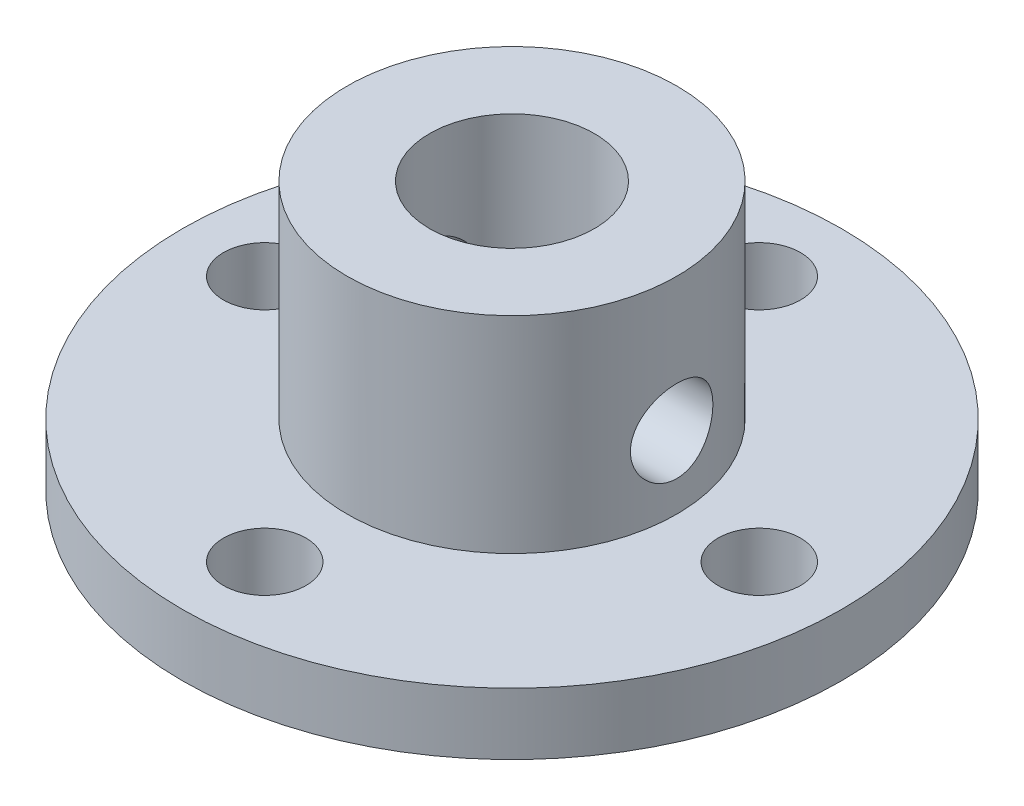
ISO-10303-21;
HEADER;
FILE_DESCRIPTION(('STEP AP214'),'2;1');
FILE_NAME('part.step','',(''),(''),'','','');
FILE_SCHEMA(('AUTOMOTIVE_DESIGN { 1 0 10303 214 1 1 1 1 }'));
ENDSEC;
DATA;
#1=APPLICATION_CONTEXT('core data for automotive mechanical design processes');
#2=APPLICATION_PROTOCOL_DEFINITION('international standard','automotive_design',2000,#1);
#3=PRODUCT_CONTEXT('',#1,'mechanical');
#4=PRODUCT('Part','Part','',(#3));
#5=PRODUCT_RELATED_PRODUCT_CATEGORY('part','',(#4));
#6=PRODUCT_DEFINITION_FORMATION('','',#4);
#7=PRODUCT_DEFINITION_CONTEXT('part definition',#1,'design');
#8=PRODUCT_DEFINITION('design','',#6,#7);
#9=PRODUCT_DEFINITION_SHAPE('','',#8);
#10=(LENGTH_UNIT() NAMED_UNIT(*) SI_UNIT(.MILLI.,.METRE.));
#11=(NAMED_UNIT(*) PLANE_ANGLE_UNIT() SI_UNIT($,.RADIAN.));
#12=(NAMED_UNIT(*) SI_UNIT($,.STERADIAN.) SOLID_ANGLE_UNIT());
#13=UNCERTAINTY_MEASURE_WITH_UNIT(LENGTH_MEASURE(1.E-05),#10,'distance_accuracy_value','');
#14=(GEOMETRIC_REPRESENTATION_CONTEXT(3) GLOBAL_UNCERTAINTY_ASSIGNED_CONTEXT((#13)) GLOBAL_UNIT_ASSIGNED_CONTEXT((#10,
#11,#12)) REPRESENTATION_CONTEXT('',''));
#15=CARTESIAN_POINT('',(0.,0.,0.));
#16=DIRECTION('',(0.,0.,1.));
#17=DIRECTION('',(1.,0.,0.));
#18=AXIS2_PLACEMENT_3D('',#15,#16,#17);
#19=CARTESIAN_POINT('',(0.,13.,0.));
#20=DIRECTION('',(0.,-1.,0.));
#21=DIRECTION('',(0.,0.,-1.));
#22=AXIS2_PLACEMENT_3D('',#19,#20,#21);
#23=CYLINDRICAL_SURFACE('',#22,8.);
#24=CARTESIAN_POINT('',(0.,13.,0.));
#25=DIRECTION('',(0.,1.,0.));
#26=DIRECTION('',(0.,0.,1.));
#27=AXIS2_PLACEMENT_3D('',#24,#25,#26);
#28=CIRCLE('',#27,8.);
#29=CARTESIAN_POINT('',(0.,13.,8.));
#30=VERTEX_POINT('',#29);
#31=EDGE_CURVE('E50',#30,#30,#28,.T.);
#32=ORIENTED_EDGE('',*,*,#31,.F.);
#33=EDGE_LOOP('',(#32));
#34=FACE_BOUND('',#33,.T.);
#35=CARTESIAN_POINT('',(0.,3.,0.));
#36=DIRECTION('',(0.,-1.,0.));
#37=DIRECTION('',(0.,0.,-1.));
#38=AXIS2_PLACEMENT_3D('',#35,#36,#37);
#39=CIRCLE('',#38,8.);
#40=CARTESIAN_POINT('',(0.,3.,-8.));
#41=VERTEX_POINT('',#40);
#42=EDGE_CURVE('E10',#41,#41,#39,.T.);
#43=ORIENTED_EDGE('',*,*,#42,.F.);
#44=EDGE_LOOP('',(#43));
#45=FACE_BOUND('',#44,.T.);
#46=CARTESIAN_POINT('',(7.74596669241484,6.5,-2.));
#47=CARTESIAN_POINT('',(7.74596880070288,6.61044060074126,-1.99999686287446));
#48=CARTESIAN_POINT('',(7.74835444811678,6.72091591894282,-1.99082099639812));
#49=CARTESIAN_POINT('',(7.75761489594051,6.93869406253881,-1.95441850037103));
#50=CARTESIAN_POINT('',(7.76449230897304,7.04599500357455,-1.92718136539368));
#51=CARTESIAN_POINT('',(7.7819097967692,7.25424283054975,-1.85559295970563));
#52=CARTESIAN_POINT('',(7.79244514152366,7.35519772430857,-1.81126378228359));
#53=CARTESIAN_POINT('',(7.81598553623007,7.54824868203191,-1.70681691300911));
#54=CARTESIAN_POINT('',(7.82899069102791,7.64034436966417,-1.64669855084855));
#55=CARTESIAN_POINT('',(7.856325730845,7.81508931620977,-1.51096674184951));
#56=CARTESIAN_POINT('',(7.87067678098427,7.89751488028004,-1.43506951016324));
#57=CARTESIAN_POINT('',(7.89890300412235,8.04860911548827,-1.27054565128053));
#58=CARTESIAN_POINT('',(7.91277813253111,8.1172765004974,-1.18191783534425));
#59=CARTESIAN_POINT('',(7.93872332416466,8.23982037410502,-0.992916160863164));
#60=CARTESIAN_POINT('',(7.95076549920474,8.29347711052917,-0.892395660956096));
#61=CARTESIAN_POINT('',(7.97144649540787,8.38304771532247,-0.683410547434209));
#62=CARTESIAN_POINT('',(7.98008581867475,8.41896420153241,-0.574947108633552));
#63=CARTESIAN_POINT('',(7.99283807078544,8.47131826766287,-0.355487007003329));
#64=CARTESIAN_POINT('',(7.99703915075451,8.48813571546127,-0.24458617563918));
#65=CARTESIAN_POINT('',(8.00074875285838,8.50300670342044,-0.0214630554102153));
#66=CARTESIAN_POINT('',(8.00025796877363,8.50106301776768,0.090759035630455));
#67=CARTESIAN_POINT('',(7.99470475962828,8.47874011979989,0.310704494344775));
#68=CARTESIAN_POINT('',(7.98974401872699,8.45877093995692,0.418472431202134));
#69=CARTESIAN_POINT('',(7.97592669219883,8.4016229839612,0.629076494827373));
#70=CARTESIAN_POINT('',(7.96706989918753,8.36444329169808,0.731912358740876));
#71=CARTESIAN_POINT('',(7.94630007760717,8.27359794345035,0.930813407003613));
#72=CARTESIAN_POINT('',(7.93436015756043,8.2197863642706,1.02680901953301));
#73=CARTESIAN_POINT('',(7.90871923047719,8.097315456707,1.20855124468098));
#74=CARTESIAN_POINT('',(7.89501791721992,8.02865354515151,1.29429607017101));
#75=CARTESIAN_POINT('',(7.86690971015616,7.8762330064141,1.45554807016991));
#76=CARTESIAN_POINT('',(7.85249375620734,7.79211608612178,1.5307153581504));
#77=CARTESIAN_POINT('',(7.82492034813365,7.6123200211678,1.66595275192604));
#78=CARTESIAN_POINT('',(7.81176295284776,7.5166403364072,1.72602215209203));
#79=CARTESIAN_POINT('',(7.78816397465319,7.31576797268083,1.8295762580452));
#80=CARTESIAN_POINT('',(7.77773586980577,7.21053141574944,1.87297913394098));
#81=CARTESIAN_POINT('',(7.76094912111966,6.99393162553884,1.94137124127268));
#82=CARTESIAN_POINT('',(7.75458960648175,6.88256970881349,1.96636441310582));
#83=CARTESIAN_POINT('',(7.74684284831312,6.6600323987815,1.99666371093214));
#84=CARTESIAN_POINT('',(7.74532871274918,6.5489297653363,2.0024723791357));
#85=CARTESIAN_POINT('',(7.74709874784831,6.32734245073748,1.99561359241244));
#86=CARTESIAN_POINT('',(7.75038247681013,6.21685771363901,1.98294783827904));
#87=CARTESIAN_POINT('',(7.76125665563648,6.00150858803624,1.93994037115013));
#88=CARTESIAN_POINT('',(7.768775761875,5.89658181874333,1.9098912546254));
#89=CARTESIAN_POINT('',(7.7872057461677,5.69325483371865,1.8332944653365));
#90=CARTESIAN_POINT('',(7.79811702598891,5.59485539275573,1.78674483817004));
#91=CARTESIAN_POINT('',(7.8223690967461,5.40524697770612,1.67741653434925));
#92=CARTESIAN_POINT('',(7.83575334885313,5.31421692796552,1.6143374030685));
#93=CARTESIAN_POINT('',(7.86333666457373,5.14384930975892,1.47412058586891));
#94=CARTESIAN_POINT('',(7.87753586182776,5.06451366667994,1.39698058961088));
#95=CARTESIAN_POINT('',(7.90557922425285,4.91775116594324,1.22852544196945));
#96=CARTESIAN_POINT('',(7.91940561649468,4.85067194996095,1.13690390506319));
#97=CARTESIAN_POINT('',(7.94477773290987,4.73285130643901,0.943405365389352));
#98=CARTESIAN_POINT('',(7.95632357603169,4.68210902671344,0.841528897915182));
#99=CARTESIAN_POINT('',(7.9757609259065,4.59884317237766,0.631116403462181));
#100=CARTESIAN_POINT('',(7.98367864017925,4.56618857249675,0.522634762055764));
#101=CARTESIAN_POINT('',(7.99508234716634,4.51963173231327,0.301499520637614));
#102=CARTESIAN_POINT('',(7.99856919514738,4.50572587300877,0.188846730082481));
#103=CARTESIAN_POINT('',(8.00068338817612,4.49726482084892,-0.0341670528866467));
#104=CARTESIAN_POINT('',(7.99943957759977,4.50219658180919,-0.144507653932044));
#105=CARTESIAN_POINT('',(7.99251792914887,4.5300956545887,-0.362734992829502));
#106=CARTESIAN_POINT('',(7.98684022314338,4.55306243002634,-0.470621803561857));
#107=CARTESIAN_POINT('',(7.97170865707778,4.61610443954172,-0.680342071289548));
#108=CARTESIAN_POINT('',(7.96227529004785,4.65608690662876,-0.782204989161726));
#109=CARTESIAN_POINT('',(7.94062577827316,4.75194115803914,-0.977834106083248));
#110=CARTESIAN_POINT('',(7.92840928277515,4.80781494534097,-1.07159928253127));
#111=CARTESIAN_POINT('',(7.90214499360574,4.93543046799227,-1.25080385684661));
#112=CARTESIAN_POINT('',(7.88806033883329,5.00752028580766,-1.33598997659667));
#113=CARTESIAN_POINT('',(7.85981298114379,5.1648457039547,-1.49323004054701));
#114=CARTESIAN_POINT('',(7.84565025934604,5.25008463222233,-1.56528065015318));
#115=CARTESIAN_POINT('',(7.81854951691005,5.43320282837892,-1.69552405294366));
#116=CARTESIAN_POINT('',(7.80563927346578,5.53128824673051,-1.75343323883276));
#117=CARTESIAN_POINT('',(7.78287910989656,5.73611097974964,-1.85185379317094));
#118=CARTESIAN_POINT('',(7.77302696466427,5.84284193218769,-1.8923778195043));
#119=CARTESIAN_POINT('',(7.75903817501475,6.04115402367032,-1.94884505714201));
#120=CARTESIAN_POINT('',(7.75417326006998,6.13178632877228,-1.96798634119376));
#121=CARTESIAN_POINT('',(7.7476367716524,6.31493773799538,-1.99356458514354));
#122=CARTESIAN_POINT('',(7.74596492578216,6.40745668048881,-2.0000026287435));
#123=CARTESIAN_POINT('',(7.74596669241484,6.5,-2.));
#124=B_SPLINE_CURVE_WITH_KNOTS('',3,(#46,#47,#48,#49,#50,#51,#52,#53,#54,#55,#56,#57,#58,#59,
#60,#61,#62,#63,#64,#65,#66,#67,#68,#69,#70,#71,#72,#73,#74,#75,#76,#77,#78,#79,#80,#81,#82,#83,
#84,#85,#86,#87,#88,#89,#90,#91,#92,#93,#94,#95,#96,#97,#98,#99,#100,#101,#102,#103,#104,#105,
#106,#107,#108,#109,#110,#111,#112,#113,#114,#115,#116,#117,#118,#119,#120,#121,#122,#123),
.UNSPECIFIED.,.T.,.F.,(4,2,2,2,2,2,2,2,2,2,2,2,2,2,2,2,2,2,2,2,2,2,2,2,2,2,2,2,2,2,2,2,2,2,2,2,
2,2,4),(0.,0.330981953388909,0.662156593142932,0.992904581732816,1.32366661404383,
1.66099163354381,1.99834817183893,2.34041197118336,2.68242527877674,3.01751000796277,
3.35254518932816,3.68014610151158,4.00776445379829,4.33834299403556,4.66897908375131,
5.00856373257529,5.34816424959842,5.68941145606722,6.03058560103638,6.36274859809374,
6.69488101747042,7.02157924007366,7.34831617137134,7.68146276687326,8.01466415108036,
8.35620264772255,8.69772332575643,9.03673658245543,9.3756843912723,9.70546756901965,
10.0352409390158,10.3632390124777,10.6912784459046,11.0271767726566,11.3631602525241,
11.7054118182895,12.0474137709606,12.3247826174462,12.6021278008238),.UNSPECIFIED.);
#125=CARTESIAN_POINT('',(7.74596669241484,6.5,-2.));
#126=VERTEX_POINT('',#125);
#127=EDGE_CURVE('E88',#126,#126,#124,.T.);
#128=ORIENTED_EDGE('',*,*,#127,.F.);
#129=EDGE_LOOP('',(#128));
#130=FACE_BOUND('',#129,.T.);
#131=CARTESIAN_POINT('',(-7.74596669241483,6.5,-2.));
#132=CARTESIAN_POINT('',(-7.74596880070288,6.38955939925874,-1.99999686287446));
#133=CARTESIAN_POINT('',(-7.74835444811678,6.27908408105718,-1.99082099639812));
#134=CARTESIAN_POINT('',(-7.75761489594051,6.06130593746119,-1.95441850037103));
#135=CARTESIAN_POINT('',(-7.76449230897304,5.95400499642545,-1.92718136539368));
#136=CARTESIAN_POINT('',(-7.7819097967692,5.74575716945026,-1.85559295970563));
#137=CARTESIAN_POINT('',(-7.79244514152366,5.64480227569144,-1.81126378228359));
#138=CARTESIAN_POINT('',(-7.81598553623007,5.4517513179681,-1.70681691300911));
#139=CARTESIAN_POINT('',(-7.82899069102791,5.35965563033583,-1.64669855084855));
#140=CARTESIAN_POINT('',(-7.856325730845,5.18491068379023,-1.51096674184951));
#141=CARTESIAN_POINT('',(-7.87067678098427,5.10248511971996,-1.43506951016324));
#142=CARTESIAN_POINT('',(-7.89890300412235,4.95139088451173,-1.27054565128053));
#143=CARTESIAN_POINT('',(-7.91277813253111,4.8827234995026,-1.18191783534425));
#144=CARTESIAN_POINT('',(-7.93872332416466,4.76017962589498,-0.992916160863165));
#145=CARTESIAN_POINT('',(-7.95076549920474,4.70652288947083,-0.892395660956097));
#146=CARTESIAN_POINT('',(-7.97144649540787,4.61695228467754,-0.683410547434211));
#147=CARTESIAN_POINT('',(-7.98008581867475,4.58103579846759,-0.574947108633553));
#148=CARTESIAN_POINT('',(-7.99283807078544,4.52868173233713,-0.355487007003329));
#149=CARTESIAN_POINT('',(-7.99703915075451,4.51186428453874,-0.244586175639181));
#150=CARTESIAN_POINT('',(-8.00074875285838,4.49699329657956,-0.0214630554102155));
#151=CARTESIAN_POINT('',(-8.00025796877363,4.49893698223232,0.090759035630455));
#152=CARTESIAN_POINT('',(-7.99470475962828,4.52125988020012,0.310704494344775));
#153=CARTESIAN_POINT('',(-7.98974401872699,4.54122906004309,0.418472431202134));
#154=CARTESIAN_POINT('',(-7.97592669219883,4.5983770160388,0.629076494827373));
#155=CARTESIAN_POINT('',(-7.96706989918753,4.63555670830193,0.731912358740876));
#156=CARTESIAN_POINT('',(-7.94630007760717,4.72640205654965,0.930813407003613));
#157=CARTESIAN_POINT('',(-7.93436015756043,4.7802136357294,1.02680901953301));
#158=CARTESIAN_POINT('',(-7.90871923047719,4.90268454329301,1.20855124468098));
#159=CARTESIAN_POINT('',(-7.89501791721992,4.9713464548485,1.29429607017101));
#160=CARTESIAN_POINT('',(-7.86690971015616,5.1237669935859,1.45554807016991));
#161=CARTESIAN_POINT('',(-7.85249375620734,5.20788391387822,1.5307153581504));
#162=CARTESIAN_POINT('',(-7.82492034813365,5.3876799788322,1.66595275192604));
#163=CARTESIAN_POINT('',(-7.81176295284776,5.4833596635928,1.72602215209203));
#164=CARTESIAN_POINT('',(-7.78816397465319,5.68423202731918,1.8295762580452));
#165=CARTESIAN_POINT('',(-7.77773586980577,5.78946858425056,1.87297913394098));
#166=CARTESIAN_POINT('',(-7.76094912111966,6.00606837446116,1.94137124127268));
#167=CARTESIAN_POINT('',(-7.75458960648175,6.11743029118651,1.96636441310582));
#168=CARTESIAN_POINT('',(-7.74684284831313,6.3399676012185,1.99666371093214));
#169=CARTESIAN_POINT('',(-7.74532871274919,6.4510702346637,2.0024723791357));
#170=CARTESIAN_POINT('',(-7.74709874784831,6.67265754926253,1.99561359241244));
#171=CARTESIAN_POINT('',(-7.75038247681013,6.78314228636099,1.98294783827904));
#172=CARTESIAN_POINT('',(-7.76125665563648,6.99849141196377,1.93994037115013));
#173=CARTESIAN_POINT('',(-7.768775761875,7.10341818125668,1.9098912546254));
#174=CARTESIAN_POINT('',(-7.7872057461677,7.30674516628135,1.8332944653365));
#175=CARTESIAN_POINT('',(-7.79811702598891,7.40514460724427,1.78674483817004));
#176=CARTESIAN_POINT('',(-7.8223690967461,7.59475302229388,1.67741653434925));
#177=CARTESIAN_POINT('',(-7.83575334885313,7.68578307203448,1.6143374030685));
#178=CARTESIAN_POINT('',(-7.86333666457373,7.85615069024108,1.47412058586891));
#179=CARTESIAN_POINT('',(-7.87753586182776,7.93548633332006,1.39698058961088));
#180=CARTESIAN_POINT('',(-7.90557922425285,8.08224883405677,1.22852544196945));
#181=CARTESIAN_POINT('',(-7.91940561649468,8.14932805003905,1.13690390506319));
#182=CARTESIAN_POINT('',(-7.94477773290987,8.267148693561,0.943405365389352));
#183=CARTESIAN_POINT('',(-7.95632357603169,8.31789097328657,0.841528897915183));
#184=CARTESIAN_POINT('',(-7.9757609259065,8.40115682762235,0.631116403462182));
#185=CARTESIAN_POINT('',(-7.98367864017925,8.43381142750325,0.522634762055765));
#186=CARTESIAN_POINT('',(-7.99508234716634,8.48036826768673,0.301499520637615));
#187=CARTESIAN_POINT('',(-7.99856919514738,8.49427412699123,0.188846730082482));
#188=CARTESIAN_POINT('',(-8.00068338817612,8.50273517915108,-0.0341670528866457));
#189=CARTESIAN_POINT('',(-7.99943957759977,8.49780341819082,-0.144507653932043));
#190=CARTESIAN_POINT('',(-7.99251792914887,8.4699043454113,-0.362734992829501));
#191=CARTESIAN_POINT('',(-7.98684022314338,8.44693756997366,-0.470621803561857));
#192=CARTESIAN_POINT('',(-7.97170865707778,8.38389556045828,-0.680342071289548));
#193=CARTESIAN_POINT('',(-7.96227529004785,8.34391309337124,-0.782204989161726));
#194=CARTESIAN_POINT('',(-7.94062577827316,8.24805884196086,-0.977834106083248));
#195=CARTESIAN_POINT('',(-7.92840928277515,8.19218505465903,-1.07159928253127));
#196=CARTESIAN_POINT('',(-7.90214499360574,8.06456953200774,-1.25080385684661));
#197=CARTESIAN_POINT('',(-7.88806033883329,7.99247971419234,-1.33598997659667));
#198=CARTESIAN_POINT('',(-7.85981298114379,7.83515429604531,-1.49323004054701));
#199=CARTESIAN_POINT('',(-7.84565025934604,7.74991536777767,-1.56528065015318));
#200=CARTESIAN_POINT('',(-7.81854951691005,7.56679717162108,-1.69552405294366));
#201=CARTESIAN_POINT('',(-7.80563927346578,7.46871175326949,-1.75343323883276));
#202=CARTESIAN_POINT('',(-7.78287910989656,7.26388902025036,-1.85185379317094));
#203=CARTESIAN_POINT('',(-7.77302696466427,7.15715806781231,-1.8923778195043));
#204=CARTESIAN_POINT('',(-7.75903817501475,6.95884597632968,-1.948845057142));
#205=CARTESIAN_POINT('',(-7.75417326006998,6.86821367122773,-1.96798634119376));
#206=CARTESIAN_POINT('',(-7.7476367716524,6.68506226200463,-1.99356458514354));
#207=CARTESIAN_POINT('',(-7.74596492578215,6.5925433195112,-2.0000026287435));
#208=CARTESIAN_POINT('',(-7.74596669241483,6.5,-2.));
#209=B_SPLINE_CURVE_WITH_KNOTS('',3,(#131,#132,#133,#134,#135,#136,#137,#138,#139,#140,#141,
#142,#143,#144,#145,#146,#147,#148,#149,#150,#151,#152,#153,#154,#155,#156,#157,#158,#159,#160,
#161,#162,#163,#164,#165,#166,#167,#168,#169,#170,#171,#172,#173,#174,#175,#176,#177,#178,#179,
#180,#181,#182,#183,#184,#185,#186,#187,#188,#189,#190,#191,#192,#193,#194,#195,#196,#197,#198,
#199,#200,#201,#202,#203,#204,#205,#206,#207,#208),.UNSPECIFIED.,.T.,.F.,(4,2,2,2,2,2,2,2,2,2,2,
2,2,2,2,2,2,2,2,2,2,2,2,2,2,2,2,2,2,2,2,2,2,2,2,2,2,2,4),(0.,0.330981953388909,
0.662156593142932,0.992904581732817,1.32366661404383,1.66099163354381,1.99834817183893,
2.34041197118336,2.68242527877674,3.01751000796277,3.35254518932816,3.68014610151158,
4.00776445379829,4.33834299403556,4.66897908375131,5.00856373257529,5.34816424959842,
5.68941145606722,6.03058560103638,6.36274859809374,6.69488101747041,7.02157924007366,
7.34831617137134,7.68146276687326,8.01466415108036,8.35620264772255,8.69772332575642,
9.03673658245543,9.3756843912723,9.70546756901965,10.0352409390158,10.3632390124777,
10.6912784459046,11.0271767726566,11.3631602525241,11.7054118182895,12.0474137709606,
12.3247826174462,12.6021278008238),.UNSPECIFIED.);
#210=CARTESIAN_POINT('',(-7.74596669241483,6.5,-2.));
#211=VERTEX_POINT('',#210);
#212=EDGE_CURVE('E93',#211,#211,#209,.T.);
#213=ORIENTED_EDGE('',*,*,#212,.F.);
#214=EDGE_LOOP('',(#213));
#215=FACE_BOUND('',#214,.T.);
#216=ADVANCED_FACE('F37',(#34,#45,#130,#215),#23,.T.);
#217=CARTESIAN_POINT('',(0.,13.,0.));
#218=DIRECTION('',(0.,-1.,0.));
#219=DIRECTION('',(0.,0.,-1.));
#220=AXIS2_PLACEMENT_3D('',#217,#218,#219);
#221=CYLINDRICAL_SURFACE('',#220,4.);
#222=CARTESIAN_POINT('',(3.46410161513776,6.5,-2.));
#223=CARTESIAN_POINT('',(3.46411185715888,6.60421320547435,-1.99999158748781));
#224=CARTESIAN_POINT('',(3.46887633544978,6.7085621765338,-1.99179963610437));
#225=CARTESIAN_POINT('',(3.48724701669072,6.9140551772306,-1.95944672580053));
#226=CARTESIAN_POINT('',(3.50087179788182,7.01519200324776,-1.93525221095662));
#227=CARTESIAN_POINT('',(3.53498701490001,7.21090315644694,-1.8721998159803));
#228=CARTESIAN_POINT('',(3.55544089069169,7.30550925884925,-1.83341988295963));
#229=CARTESIAN_POINT('',(3.60085327291133,7.48684845047615,-1.74253507245138));
#230=CARTESIAN_POINT('',(3.62581202301253,7.57358111343677,-1.69042947410139));
#231=CARTESIAN_POINT('',(3.67993738819289,7.74461144313339,-1.569333074538));
#232=CARTESIAN_POINT('',(3.70928127465103,7.82811826759177,-1.49930407053533));
#233=CARTESIAN_POINT('',(3.76743965382121,7.9828167805706,-1.34650761698202));
#234=CARTESIAN_POINT('',(3.79625387610258,8.05400232620397,-1.26373385204841));
#235=CARTESIAN_POINT('',(3.85242953961661,8.1867343011885,-1.08097912631265));
#236=CARTESIAN_POINT('',(3.87956212851245,8.24730753542331,-0.980214377887153));
#237=CARTESIAN_POINT('',(3.92701512184167,8.35028170678709,-0.768314053336916));
#238=CARTESIAN_POINT('',(3.94733982363631,8.3926941123508,-0.657185076311985));
#239=CARTESIAN_POINT('',(3.97760922492053,8.45500932253118,-0.436089887818817));
#240=CARTESIAN_POINT('',(3.98818960442739,8.4762990526921,-0.326603580968785));
#241=CARTESIAN_POINT('',(4.00015167691179,8.50033223736903,-0.10514125740454));
#242=CARTESIAN_POINT('',(4.00153893568934,8.50308691359628,0.00683321168520758));
#243=CARTESIAN_POINT('',(3.99525963833124,8.49050665205486,0.219665048849572));
#244=CARTESIAN_POINT('',(3.98836991784381,8.47672396895637,0.320642398354138));
#245=CARTESIAN_POINT('',(3.96748490519435,8.43423831219188,0.518627543836088));
#246=CARTESIAN_POINT('',(3.95348908132771,8.40553422204788,0.615635042187701));
#247=CARTESIAN_POINT('',(3.91943166575325,8.33383486782005,0.804618783139259));
#248=CARTESIAN_POINT('',(3.89928883058403,8.29064737365578,0.896506847030398));
#249=CARTESIAN_POINT('',(3.8547529197337,8.1914731675971,1.07195360302662));
#250=CARTESIAN_POINT('',(3.83035832314967,8.13548187339533,1.15550929767728));
#251=CARTESIAN_POINT('',(3.7768878879846,8.00620929693394,1.3203473217964));
#252=CARTESIAN_POINT('',(3.7475875199635,7.93179394334797,1.40066815005872));
#253=CARTESIAN_POINT('',(3.68908681173623,7.77082055013965,1.54820874059556));
#254=CARTESIAN_POINT('',(3.65988656531257,7.68425325545188,1.61541842314846));
#255=CARTESIAN_POINT('',(3.60288312184969,7.49470361515182,1.73901066928442));
#256=CARTESIAN_POINT('',(3.57528639981415,7.39102795389158,1.7944346299561));
#257=CARTESIAN_POINT('',(3.52750900557152,7.174124657282,1.88663822600246));
#258=CARTESIAN_POINT('',(3.50732060092135,7.06090713396488,1.92343731642178));
#259=CARTESIAN_POINT('',(3.47889271634069,6.83757097743442,1.97436042205008));
#260=CARTESIAN_POINT('',(3.46983311696993,6.7279177619129,1.99005024423995));
#261=CARTESIAN_POINT('',(3.46235838723219,6.50719731696691,2.00303389322285));
#262=CARTESIAN_POINT('',(3.46393573778623,6.3961311417604,2.00034071463005));
#263=CARTESIAN_POINT('',(3.4766867308117,6.18869216284256,1.97807208668793));
#264=CARTESIAN_POINT('',(3.48679175013308,6.09204109778422,1.96037563342492));
#265=CARTESIAN_POINT('',(3.51388043102682,5.90326442745801,1.91139256926489));
#266=CARTESIAN_POINT('',(3.53086632010068,5.81114029850652,1.88010155724727));
#267=CARTESIAN_POINT('',(3.57072444159313,5.62917733819488,1.80329517720973));
#268=CARTESIAN_POINT('',(3.59383286486126,5.53964196629395,1.7571881273853));
#269=CARTESIAN_POINT('',(3.643122389945,5.36906145692096,1.65257412803176));
#270=CARTESIAN_POINT('',(3.66930506710298,5.28802071296949,1.59406080866498));
#271=CARTESIAN_POINT('',(3.72575996912669,5.12604246495734,1.45767433439708));
#272=CARTESIAN_POINT('',(3.75613166308566,5.04640569858222,1.37829054462748));
#273=CARTESIAN_POINT('',(3.81468469955797,4.90117552399527,1.20680899079904));
#274=CARTESIAN_POINT('',(3.84286530015463,4.83558685947316,1.11470694931991));
#275=CARTESIAN_POINT('',(3.89482723381867,4.71885254816729,0.917070725108058));
#276=CARTESIAN_POINT('',(3.91847283343884,4.66813376383323,0.811246195112494));
#277=CARTESIAN_POINT('',(3.95766709918776,4.58572419203039,0.591044729317864));
#278=CARTESIAN_POINT('',(3.97322287353397,4.5540166963159,0.476675402917652));
#279=CARTESIAN_POINT('',(3.99335016363174,4.51326287251486,0.253959364539763));
#280=CARTESIAN_POINT('',(3.9987985581427,4.50240425133573,0.1460228872683));
#281=CARTESIAN_POINT('',(4.00084260752374,4.49831346600433,-0.070251971469946));
#282=CARTESIAN_POINT('',(3.99744136141634,4.50507513147113,-0.178590198981615));
#283=CARTESIAN_POINT('',(3.98267937668509,4.53483282431641,-0.38507598613686));
#284=CARTESIAN_POINT('',(3.97185789309443,4.55672973730905,-0.48342464105742));
#285=CARTESIAN_POINT('',(3.94384187353387,4.61465395980667,-0.674891898931566));
#286=CARTESIAN_POINT('',(3.92664642364424,4.65068329570691,-0.768009749669773));
#287=CARTESIAN_POINT('',(3.8865186139318,4.73745425499141,-0.950846833596742));
#288=CARTESIAN_POINT('',(3.86337234005403,4.78875921975186,-1.0402503657229));
#289=CARTESIAN_POINT('',(3.81376266676027,4.9039152881181,-1.20954920326828));
#290=CARTESIAN_POINT('',(3.78729774583427,4.96777215410157,-1.28944011444319));
#291=CARTESIAN_POINT('',(3.73057218840582,5.11359663555942,-1.44582833859495));
#292=CARTESIAN_POINT('',(3.70019591726075,5.19673418080029,-1.52119665879199));
#293=CARTESIAN_POINT('',(3.64126158628571,5.37489222830609,-1.65732528394006));
#294=CARTESIAN_POINT('',(3.61270515130784,5.46992313136052,-1.71807266521244));
#295=CARTESIAN_POINT('',(3.55999186256751,5.67330889413025,-1.82486714716811));
#296=CARTESIAN_POINT('',(3.53600256268535,5.78198991073527,-1.87038902381914));
#297=CARTESIAN_POINT('',(3.5069621813237,5.95057811963095,-1.92395929504801));
#298=CARTESIAN_POINT('',(3.49844389329401,6.00764782059068,-1.93935666147967));
#299=CARTESIAN_POINT('',(3.48406059323535,6.12323255750019,-1.96508069805043));
#300=CARTESIAN_POINT('',(3.4781937263605,6.18174655275425,-1.97541091343282));
#301=CARTESIAN_POINT('',(3.47059023668758,6.28360078924729,-1.9887293296122));
#302=CARTESIAN_POINT('',(3.46816389731815,6.32673305725008,-1.99295091983786));
#303=CARTESIAN_POINT('',(3.46491740045177,6.4132356930929,-1.99858810035606));
#304=CARTESIAN_POINT('',(3.46409735040492,6.4566060766667,-2.00000350293331));
#305=CARTESIAN_POINT('',(3.46410161513776,6.5,-2.));
#306=B_SPLINE_CURVE_WITH_KNOTS('',3,(#222,#223,#224,#225,#226,#227,#228,#229,#230,#231,#232,
#233,#234,#235,#236,#237,#238,#239,#240,#241,#242,#243,#244,#245,#246,#247,#248,#249,#250,#251,
#252,#253,#254,#255,#256,#257,#258,#259,#260,#261,#262,#263,#264,#265,#266,#267,#268,#269,#270,
#271,#272,#273,#274,#275,#276,#277,#278,#279,#280,#281,#282,#283,#284,#285,#286,#287,#288,#289,
#290,#291,#292,#293,#294,#295,#296,#297,#298,#299,#300,#301,#302,#303,#304,#305),.UNSPECIFIED.,
.T.,.F.,(4,2,2,2,2,2,2,2,2,2,2,2,2,2,2,2,2,2,2,2,2,2,2,2,2,2,2,2,2,2,2,2,2,2,2,2,2,2,2,2,2,4),
(0.,0.312464245189431,0.625585785649609,0.937057191861536,1.24854545093096,1.58572462503713,
1.92307142172809,2.28315784481594,2.64301653931849,2.97726969939937,3.31132047376147,
3.61632194973143,3.92134625038977,4.2305906946636,4.5399459870461,4.87854382917848,
5.21740096495904,5.57777683462964,5.93777548427477,6.2692458171249,6.60048186380813,
6.89548366852118,7.19058104876193,7.49934592816242,7.80826972444162,8.15613487165293,
8.50411729960471,8.86128362829998,9.2181355962161,9.54224540783041,9.8662417359201,
10.1688884974705,10.4715786702809,10.7872150144301,11.1029966020551,11.450204837042,
11.7977188569438,12.1562149808128,12.3351395323571,12.5139387197526,12.6440387634036,
12.7741475095882),.UNSPECIFIED.);
#307=CARTESIAN_POINT('',(3.46410161513776,6.5,-2.));
#308=VERTEX_POINT('',#307);
#309=EDGE_CURVE('E66',#308,#308,#306,.T.);
#310=ORIENTED_EDGE('',*,*,#309,.T.);
#311=EDGE_LOOP('',(#310));
#312=FACE_BOUND('',#311,.T.);
#313=CARTESIAN_POINT('',(0.,0.,0.));
#314=DIRECTION('',(0.,1.,0.));
#315=DIRECTION('',(0.,0.,1.));
#316=AXIS2_PLACEMENT_3D('',#313,#314,#315);
#317=CIRCLE('',#316,4.);
#318=CARTESIAN_POINT('',(0.,0.,4.));
#319=VERTEX_POINT('',#318);
#320=EDGE_CURVE('E63',#319,#319,#317,.T.);
#321=ORIENTED_EDGE('',*,*,#320,.F.);
#322=EDGE_LOOP('',(#321));
#323=FACE_BOUND('',#322,.T.);
#324=CARTESIAN_POINT('',(0.,13.,0.));
#325=DIRECTION('',(0.,1.,0.));
#326=DIRECTION('',(0.,0.,1.));
#327=AXIS2_PLACEMENT_3D('',#324,#325,#326);
#328=CIRCLE('',#327,4.);
#329=CARTESIAN_POINT('',(0.,13.,4.));
#330=VERTEX_POINT('',#329);
#331=EDGE_CURVE('E55',#330,#330,#328,.T.);
#332=ORIENTED_EDGE('',*,*,#331,.T.);
#333=EDGE_LOOP('',(#332));
#334=FACE_BOUND('',#333,.T.);
#335=CARTESIAN_POINT('',(-3.46410161513775,6.5,-2.));
#336=CARTESIAN_POINT('',(-3.46411185715887,6.39578679452566,-1.99999158748781));
#337=CARTESIAN_POINT('',(-3.46887633544978,6.2914378234662,-1.99179963610437));
#338=CARTESIAN_POINT('',(-3.48724701669072,6.0859448227694,-1.95944672580053));
#339=CARTESIAN_POINT('',(-3.50087179788183,5.98480799675224,-1.93525221095662));
#340=CARTESIAN_POINT('',(-3.53498701490001,5.78909684355307,-1.8721998159803));
#341=CARTESIAN_POINT('',(-3.55544089069169,5.69449074115075,-1.83341988295963));
#342=CARTESIAN_POINT('',(-3.60085327291133,5.51315154952385,-1.74253507245138));
#343=CARTESIAN_POINT('',(-3.62581202301253,5.42641888656323,-1.69042947410139));
#344=CARTESIAN_POINT('',(-3.67993738819289,5.25538855686662,-1.569333074538));
#345=CARTESIAN_POINT('',(-3.70928127465103,5.17188173240823,-1.49930407053533));
#346=CARTESIAN_POINT('',(-3.76743965382121,5.0171832194294,-1.34650761698202));
#347=CARTESIAN_POINT('',(-3.79625387610258,4.94599767379603,-1.26373385204841));
#348=CARTESIAN_POINT('',(-3.85242953961661,4.8132656988115,-1.08097912631265));
#349=CARTESIAN_POINT('',(-3.87956212851245,4.75269246457669,-0.980214377887153));
#350=CARTESIAN_POINT('',(-3.92701512184167,4.64971829321291,-0.768314053336917));
#351=CARTESIAN_POINT('',(-3.94733982363631,4.6073058876492,-0.657185076311985));
#352=CARTESIAN_POINT('',(-3.97760922492053,4.54499067746882,-0.436089887818817));
#353=CARTESIAN_POINT('',(-3.98818960442739,4.5237009473079,-0.326603580968785));
#354=CARTESIAN_POINT('',(-4.00015167691179,4.49966776263097,-0.105141257404541));
#355=CARTESIAN_POINT('',(-4.00153893568934,4.49691308640372,0.00683321168520728));
#356=CARTESIAN_POINT('',(-3.99525963833124,4.50949334794514,0.219665048849572));
#357=CARTESIAN_POINT('',(-3.98836991784381,4.52327603104364,0.320642398354138));
#358=CARTESIAN_POINT('',(-3.96748490519435,4.56576168780813,0.518627543836088));
#359=CARTESIAN_POINT('',(-3.95348908132771,4.59446577795213,0.615635042187701));
#360=CARTESIAN_POINT('',(-3.91943166575325,4.66616513217995,0.804618783139259));
#361=CARTESIAN_POINT('',(-3.89928883058403,4.70935262634422,0.896506847030398));
#362=CARTESIAN_POINT('',(-3.8547529197337,4.8085268324029,1.07195360302662));
#363=CARTESIAN_POINT('',(-3.83035832314967,4.86451812660468,1.15550929767728));
#364=CARTESIAN_POINT('',(-3.7768878879846,4.99379070306606,1.3203473217964));
#365=CARTESIAN_POINT('',(-3.7475875199635,5.06820605665203,1.40066815005872));
#366=CARTESIAN_POINT('',(-3.68908681173623,5.22917944986035,1.54820874059556));
#367=CARTESIAN_POINT('',(-3.65988656531257,5.31574674454812,1.61541842314846));
#368=CARTESIAN_POINT('',(-3.60288312184969,5.50529638484818,1.73901066928442));
#369=CARTESIAN_POINT('',(-3.57528639981415,5.60897204610842,1.7944346299561));
#370=CARTESIAN_POINT('',(-3.52750900557152,5.825875342718,1.88663822600246));
#371=CARTESIAN_POINT('',(-3.50732060092135,5.93909286603513,1.92343731642178));
#372=CARTESIAN_POINT('',(-3.47889271634069,6.16242902256558,1.97436042205008));
#373=CARTESIAN_POINT('',(-3.46983311696993,6.2720822380871,1.99005024423995));
#374=CARTESIAN_POINT('',(-3.46235838723219,6.49280268303309,2.00303389322285));
#375=CARTESIAN_POINT('',(-3.46393573778623,6.6038688582396,2.00034071463005));
#376=CARTESIAN_POINT('',(-3.4766867308117,6.81130783715744,1.97807208668793));
#377=CARTESIAN_POINT('',(-3.48679175013308,6.90795890221579,1.96037563342492));
#378=CARTESIAN_POINT('',(-3.51388043102682,7.09673557254199,1.91139256926489));
#379=CARTESIAN_POINT('',(-3.53086632010068,7.18885970149348,1.88010155724727));
#380=CARTESIAN_POINT('',(-3.57072444159313,7.37082266180512,1.80329517720973));
#381=CARTESIAN_POINT('',(-3.59383286486126,7.46035803370605,1.7571881273853));
#382=CARTESIAN_POINT('',(-3.643122389945,7.63093854307904,1.65257412803176));
#383=CARTESIAN_POINT('',(-3.66930506710298,7.71197928703051,1.59406080866498));
#384=CARTESIAN_POINT('',(-3.72575996912669,7.87395753504266,1.45767433439709));
#385=CARTESIAN_POINT('',(-3.75613166308566,7.95359430141778,1.37829054462748));
#386=CARTESIAN_POINT('',(-3.81468469955797,8.09882447600473,1.20680899079904));
#387=CARTESIAN_POINT('',(-3.84286530015463,8.16441314052684,1.11470694931991));
#388=CARTESIAN_POINT('',(-3.89482723381867,8.28114745183271,0.917070725108059));
#389=CARTESIAN_POINT('',(-3.91847283343884,8.33186623616677,0.811246195112494));
#390=CARTESIAN_POINT('',(-3.95766709918776,8.41427580796961,0.591044729317864));
#391=CARTESIAN_POINT('',(-3.97322287353397,8.4459833036841,0.476675402917653));
#392=CARTESIAN_POINT('',(-3.99335016363174,8.48673712748514,0.253959364539764));
#393=CARTESIAN_POINT('',(-3.9987985581427,8.49759574866428,0.146022887268301));
#394=CARTESIAN_POINT('',(-4.00084260752374,8.50168653399568,-0.070251971469945));
#395=CARTESIAN_POINT('',(-3.99744136141634,8.49492486852887,-0.178590198981614));
#396=CARTESIAN_POINT('',(-3.98267937668509,8.4651671756836,-0.385075986136858));
#397=CARTESIAN_POINT('',(-3.97185789309443,8.44327026269095,-0.483424641057418));
#398=CARTESIAN_POINT('',(-3.94384187353387,8.38534604019333,-0.674891898931564));
#399=CARTESIAN_POINT('',(-3.92664642364424,8.34931670429309,-0.768009749669771));
#400=CARTESIAN_POINT('',(-3.8865186139318,8.2625457450086,-0.950846833596741));
#401=CARTESIAN_POINT('',(-3.86337234005404,8.21124078024814,-1.0402503657229));
#402=CARTESIAN_POINT('',(-3.81376266676027,8.09608471188191,-1.20954920326828));
#403=CARTESIAN_POINT('',(-3.78729774583427,8.03222784589844,-1.28944011444319));
#404=CARTESIAN_POINT('',(-3.73057218840582,7.88640336444059,-1.44582833859495));
#405=CARTESIAN_POINT('',(-3.70019591726075,7.80326581919972,-1.52119665879199));
#406=CARTESIAN_POINT('',(-3.64126158628571,7.62510777169391,-1.65732528394006));
#407=CARTESIAN_POINT('',(-3.61270515130784,7.53007686863949,-1.71807266521244));
#408=CARTESIAN_POINT('',(-3.55999186256751,7.32669110586976,-1.82486714716811));
#409=CARTESIAN_POINT('',(-3.53600256268535,7.21801008926473,-1.87038902381914));
#410=CARTESIAN_POINT('',(-3.5069621813237,7.04942188036906,-1.92395929504801));
#411=CARTESIAN_POINT('',(-3.49844389329401,6.99235217940932,-1.93935666147967));
#412=CARTESIAN_POINT('',(-3.48406059323535,6.87676744249981,-1.96508069805043));
#413=CARTESIAN_POINT('',(-3.4781937263605,6.81825344724575,-1.97541091343282));
#414=CARTESIAN_POINT('',(-3.47059023668758,6.71639921075271,-1.9887293296122));
#415=CARTESIAN_POINT('',(-3.46816389731816,6.67326694274993,-1.99295091983786));
#416=CARTESIAN_POINT('',(-3.46491740045177,6.58676430690711,-1.99858810035606));
#417=CARTESIAN_POINT('',(-3.46409735040492,6.5433939233333,-2.00000350293331));
#418=CARTESIAN_POINT('',(-3.46410161513775,6.5,-2.));
#419=B_SPLINE_CURVE_WITH_KNOTS('',3,(#335,#336,#337,#338,#339,#340,#341,#342,#343,#344,#345,
#346,#347,#348,#349,#350,#351,#352,#353,#354,#355,#356,#357,#358,#359,#360,#361,#362,#363,#364,
#365,#366,#367,#368,#369,#370,#371,#372,#373,#374,#375,#376,#377,#378,#379,#380,#381,#382,#383,
#384,#385,#386,#387,#388,#389,#390,#391,#392,#393,#394,#395,#396,#397,#398,#399,#400,#401,#402,
#403,#404,#405,#406,#407,#408,#409,#410,#411,#412,#413,#414,#415,#416,#417,#418),.UNSPECIFIED.,
.T.,.F.,(4,2,2,2,2,2,2,2,2,2,2,2,2,2,2,2,2,2,2,2,2,2,2,2,2,2,2,2,2,2,2,2,2,2,2,2,2,2,2,2,2,4),
(0.,0.312464245189432,0.62558578564961,0.937057191861536,1.24854545093097,1.58572462503713,
1.92307142172809,2.28315784481594,2.64301653931849,2.97726969939937,3.31132047376147,
3.61632194973143,3.92134625038977,4.2305906946636,4.5399459870461,4.87854382917848,
5.21740096495904,5.57777683462963,5.93777548427477,6.2692458171249,6.60048186380813,
6.89548366852118,7.19058104876193,7.49934592816242,7.80826972444161,8.15613487165293,
8.50411729960471,8.86128362829998,9.2181355962161,9.5422454078304,9.8662417359201,
10.1688884974705,10.4715786702809,10.7872150144301,11.102996602055,11.450204837042,
11.7977188569438,12.1562149808128,12.3351395323571,12.5139387197526,12.6440387634036,
12.7741475095882),.UNSPECIFIED.);
#420=CARTESIAN_POINT('',(-3.46410161513775,6.5,-2.));
#421=VERTEX_POINT('',#420);
#422=EDGE_CURVE('E41',#421,#421,#419,.T.);
#423=ORIENTED_EDGE('',*,*,#422,.T.);
#424=EDGE_LOOP('',(#423));
#425=FACE_BOUND('',#424,.T.);
#426=ADVANCED_FACE('F71',(#312,#323,#334,#425),#221,.F.);
#427=CARTESIAN_POINT('',(0.,13.,0.));
#428=DIRECTION('',(0.,1.,0.));
#429=DIRECTION('',(0.,0.,1.));
#430=AXIS2_PLACEMENT_3D('',#427,#428,#429);
#431=PLANE('',#430);
#432=ORIENTED_EDGE('',*,*,#31,.T.);
#433=EDGE_LOOP('',(#432));
#434=FACE_BOUND('',#433,.T.);
#435=ORIENTED_EDGE('',*,*,#331,.F.);
#436=EDGE_LOOP('',(#435));
#437=FACE_BOUND('',#436,.T.);
#438=ADVANCED_FACE('F149',(#434,#437),#431,.T.);
#439=CARTESIAN_POINT('',(0.,0.,0.));
#440=DIRECTION('',(0.,1.,0.));
#441=DIRECTION('',(0.,0.,1.));
#442=AXIS2_PLACEMENT_3D('',#439,#440,#441);
#443=PLANE('',#442);
#444=ORIENTED_EDGE('',*,*,#320,.T.);
#445=EDGE_LOOP('',(#444));
#446=FACE_BOUND('',#445,.T.);
#447=CARTESIAN_POINT('',(0.,0.,0.));
#448=DIRECTION('',(0.,-1.,0.));
#449=DIRECTION('',(0.,0.,-1.));
#450=AXIS2_PLACEMENT_3D('',#447,#448,#449);
#451=CIRCLE('',#450,16.);
#452=CARTESIAN_POINT('',(0.,0.,-16.));
#453=VERTEX_POINT('',#452);
#454=EDGE_CURVE('E59',#453,#453,#451,.T.);
#455=ORIENTED_EDGE('',*,*,#454,.T.);
#456=EDGE_LOOP('',(#455));
#457=FACE_BOUND('',#456,.T.);
#458=CARTESIAN_POINT('',(0.,0.,12.));
#459=DIRECTION('',(0.,-1.,0.));
#460=DIRECTION('',(0.,0.,-1.));
#461=AXIS2_PLACEMENT_3D('',#458,#459,#460);
#462=CIRCLE('',#461,2.);
#463=CARTESIAN_POINT('',(0.,0.,10.));
#464=VERTEX_POINT('',#463);
#465=EDGE_CURVE('E115',#464,#464,#462,.T.);
#466=ORIENTED_EDGE('',*,*,#465,.F.);
#467=EDGE_LOOP('',(#466));
#468=FACE_BOUND('',#467,.T.);
#469=CARTESIAN_POINT('',(12.,0.,0.));
#470=DIRECTION('',(0.,-1.,0.));
#471=DIRECTION('',(0.,0.,-1.));
#472=AXIS2_PLACEMENT_3D('',#469,#470,#471);
#473=CIRCLE('',#472,2.);
#474=CARTESIAN_POINT('',(12.,0.,-2.00000000000004));
#475=VERTEX_POINT('',#474);
#476=EDGE_CURVE('E109',#475,#475,#473,.T.);
#477=ORIENTED_EDGE('',*,*,#476,.F.);
#478=EDGE_LOOP('',(#477));
#479=FACE_BOUND('',#478,.T.);
#480=CARTESIAN_POINT('',(3.36651784687918E-13,0.,-12.));
#481=DIRECTION('',(0.,-1.,0.));
#482=DIRECTION('',(0.,0.,-1.));
#483=AXIS2_PLACEMENT_3D('',#480,#481,#482);
#484=CIRCLE('',#483,2.0000000000004);
#485=CARTESIAN_POINT('',(3.36651784687918E-13,0.,-14.0000000000004));
#486=VERTEX_POINT('',#485);
#487=EDGE_CURVE('E103',#486,#486,#484,.T.);
#488=ORIENTED_EDGE('',*,*,#487,.F.);
#489=EDGE_LOOP('',(#488));
#490=FACE_BOUND('',#489,.T.);
#491=CARTESIAN_POINT('',(-12.,0.,1.25693328198353E-13));
#492=DIRECTION('',(0.,-1.,0.));
#493=DIRECTION('',(0.,0.,-1.));
#494=AXIS2_PLACEMENT_3D('',#491,#492,#493);
#495=CIRCLE('',#494,2.);
#496=CARTESIAN_POINT('',(-12.,0.,-1.99999999999987));
#497=VERTEX_POINT('',#496);
#498=EDGE_CURVE('E99',#497,#497,#495,.T.);
#499=ORIENTED_EDGE('',*,*,#498,.F.);
#500=EDGE_LOOP('',(#499));
#501=FACE_BOUND('',#500,.T.);
#502=ADVANCED_FACE('F128',(#446,#457,#468,#479,#490,#501),#443,.F.);
#503=CARTESIAN_POINT('',(0.,3.,0.));
#504=DIRECTION('',(0.,-1.,0.));
#505=DIRECTION('',(0.,0.,-1.));
#506=AXIS2_PLACEMENT_3D('',#503,#504,#505);
#507=PLANE('',#506);
#508=CARTESIAN_POINT('',(0.,3.,0.));
#509=DIRECTION('',(0.,-1.,0.));
#510=DIRECTION('',(0.,0.,-1.));
#511=AXIS2_PLACEMENT_3D('',#508,#509,#510);
#512=CIRCLE('',#511,16.);
#513=CARTESIAN_POINT('',(0.,3.,-16.));
#514=VERTEX_POINT('',#513);
#515=EDGE_CURVE('E65',#514,#514,#512,.T.);
#516=ORIENTED_EDGE('',*,*,#515,.F.);
#517=EDGE_LOOP('',(#516));
#518=FACE_BOUND('',#517,.T.);
#519=CARTESIAN_POINT('',(0.,3.,12.));
#520=DIRECTION('',(0.,-1.,0.));
#521=DIRECTION('',(0.,0.,-1.));
#522=AXIS2_PLACEMENT_3D('',#519,#520,#521);
#523=CIRCLE('',#522,2.);
#524=CARTESIAN_POINT('',(0.,3.,10.));
#525=VERTEX_POINT('',#524);
#526=EDGE_CURVE('E118',#525,#525,#523,.T.);
#527=ORIENTED_EDGE('',*,*,#526,.T.);
#528=EDGE_LOOP('',(#527));
#529=FACE_BOUND('',#528,.T.);
#530=CARTESIAN_POINT('',(12.,3.,0.));
#531=DIRECTION('',(0.,-1.,0.));
#532=DIRECTION('',(0.,0.,-1.));
#533=AXIS2_PLACEMENT_3D('',#530,#531,#532);
#534=CIRCLE('',#533,2.);
#535=CARTESIAN_POINT('',(12.,3.,-2.00000000000004));
#536=VERTEX_POINT('',#535);
#537=EDGE_CURVE('E112',#536,#536,#534,.T.);
#538=ORIENTED_EDGE('',*,*,#537,.T.);
#539=EDGE_LOOP('',(#538));
#540=FACE_BOUND('',#539,.T.);
#541=CARTESIAN_POINT('',(3.36651784687918E-13,3.,-12.));
#542=DIRECTION('',(0.,-1.,0.));
#543=DIRECTION('',(0.,0.,-1.));
#544=AXIS2_PLACEMENT_3D('',#541,#542,#543);
#545=CIRCLE('',#544,2.0000000000004);
#546=CARTESIAN_POINT('',(3.36651784687918E-13,3.,-14.0000000000004));
#547=VERTEX_POINT('',#546);
#548=EDGE_CURVE('E106',#547,#547,#545,.T.);
#549=ORIENTED_EDGE('',*,*,#548,.T.);
#550=EDGE_LOOP('',(#549));
#551=FACE_BOUND('',#550,.T.);
#552=CARTESIAN_POINT('',(-12.,3.,1.25693328198353E-13));
#553=DIRECTION('',(0.,-1.,0.));
#554=DIRECTION('',(0.,0.,-1.));
#555=AXIS2_PLACEMENT_3D('',#552,#553,#554);
#556=CIRCLE('',#555,2.);
#557=CARTESIAN_POINT('',(-12.,3.,-1.99999999999987));
#558=VERTEX_POINT('',#557);
#559=EDGE_CURVE('E100',#558,#558,#556,.T.);
#560=ORIENTED_EDGE('',*,*,#559,.T.);
#561=EDGE_LOOP('',(#560));
#562=FACE_BOUND('',#561,.T.);
#563=ORIENTED_EDGE('',*,*,#42,.T.);
#564=EDGE_LOOP('',(#563));
#565=FACE_BOUND('',#564,.T.);
#566=ADVANCED_FACE('F134',(#518,#529,#540,#551,#562,#565),#507,.F.);
#567=CARTESIAN_POINT('',(0.,3.,0.));
#568=DIRECTION('',(0.,-1.,0.));
#569=DIRECTION('',(0.,0.,-1.));
#570=AXIS2_PLACEMENT_3D('',#567,#568,#569);
#571=CYLINDRICAL_SURFACE('',#570,16.);
#572=ORIENTED_EDGE('',*,*,#515,.T.);
#573=EDGE_LOOP('',(#572));
#574=FACE_BOUND('',#573,.T.);
#575=ORIENTED_EDGE('',*,*,#454,.F.);
#576=EDGE_LOOP('',(#575));
#577=FACE_BOUND('',#576,.T.);
#578=ADVANCED_FACE('F131',(#574,#577),#571,.T.);
#579=CARTESIAN_POINT('',(0.,3.,12.));
#580=DIRECTION('',(0.,-1.,0.));
#581=DIRECTION('',(0.,0.,-1.));
#582=AXIS2_PLACEMENT_3D('',#579,#580,#581);
#583=CYLINDRICAL_SURFACE('',#582,2.);
#584=ORIENTED_EDGE('',*,*,#526,.F.);
#585=EDGE_LOOP('',(#584));
#586=FACE_BOUND('',#585,.T.);
#587=ORIENTED_EDGE('',*,*,#465,.T.);
#588=EDGE_LOOP('',(#587));
#589=FACE_BOUND('',#588,.T.);
#590=ADVANCED_FACE('F133',(#586,#589),#583,.F.);
#591=CARTESIAN_POINT('',(12.,3.,0.));
#592=DIRECTION('',(0.,-1.,0.));
#593=DIRECTION('',(0.,0.,-1.));
#594=AXIS2_PLACEMENT_3D('',#591,#592,#593);
#595=CYLINDRICAL_SURFACE('',#594,2.);
#596=ORIENTED_EDGE('',*,*,#537,.F.);
#597=EDGE_LOOP('',(#596));
#598=FACE_BOUND('',#597,.T.);
#599=ORIENTED_EDGE('',*,*,#476,.T.);
#600=EDGE_LOOP('',(#599));
#601=FACE_BOUND('',#600,.T.);
#602=ADVANCED_FACE('F139',(#598,#601),#595,.F.);
#603=CARTESIAN_POINT('',(3.36651784687918E-13,3.,-12.));
#604=DIRECTION('',(0.,-1.,0.));
#605=DIRECTION('',(0.,0.,-1.));
#606=AXIS2_PLACEMENT_3D('',#603,#604,#605);
#607=CYLINDRICAL_SURFACE('',#606,2.0000000000004);
#608=ORIENTED_EDGE('',*,*,#548,.F.);
#609=EDGE_LOOP('',(#608));
#610=FACE_BOUND('',#609,.T.);
#611=ORIENTED_EDGE('',*,*,#487,.T.);
#612=EDGE_LOOP('',(#611));
#613=FACE_BOUND('',#612,.T.);
#614=ADVANCED_FACE('F164',(#610,#613),#607,.F.);
#615=CARTESIAN_POINT('',(-12.,3.,1.25693328198353E-13));
#616=DIRECTION('',(0.,-1.,0.));
#617=DIRECTION('',(0.,0.,-1.));
#618=AXIS2_PLACEMENT_3D('',#615,#616,#617);
#619=CYLINDRICAL_SURFACE('',#618,2.);
#620=ORIENTED_EDGE('',*,*,#559,.F.);
#621=EDGE_LOOP('',(#620));
#622=FACE_BOUND('',#621,.T.);
#623=ORIENTED_EDGE('',*,*,#498,.T.);
#624=EDGE_LOOP('',(#623));
#625=FACE_BOUND('',#624,.T.);
#626=ADVANCED_FACE('F81',(#622,#625),#619,.F.);
#627=CARTESIAN_POINT('',(-11.,6.5,0.));
#628=DIRECTION('',(1.,0.,0.));
#629=DIRECTION('',(0.,0.,-1.));
#630=AXIS2_PLACEMENT_3D('',#627,#628,#629);
#631=CYLINDRICAL_SURFACE('',#630,2.);
#632=ORIENTED_EDGE('',*,*,#309,.F.);
#633=EDGE_LOOP('',(#632));
#634=FACE_BOUND('',#633,.T.);
#635=ORIENTED_EDGE('',*,*,#127,.T.);
#636=EDGE_LOOP('',(#635));
#637=FACE_BOUND('',#636,.T.);
#638=ADVANCED_FACE('F79',(#634,#637),#631,.F.);
#639=ORIENTED_EDGE('',*,*,#422,.F.);
#640=EDGE_LOOP('',(#639));
#641=FACE_BOUND('',#640,.T.);
#642=ORIENTED_EDGE('',*,*,#212,.T.);
#643=EDGE_LOOP('',(#642));
#644=FACE_BOUND('',#643,.T.);
#645=ADVANCED_FACE('F75',(#641,#644),#631,.F.);
#646=CLOSED_SHELL('',(#216,#426,#438,#502,#566,#578,#590,#602,#614,#626,#638,#645));
#647=MANIFOLD_SOLID_BREP('B2',#646);
#648=ADVANCED_BREP_SHAPE_REPRESENTATION('',(#18,#647),#14);
#649=SHAPE_DEFINITION_REPRESENTATION(#9,#648);
ENDSEC;
END-ISO-10303-21;
